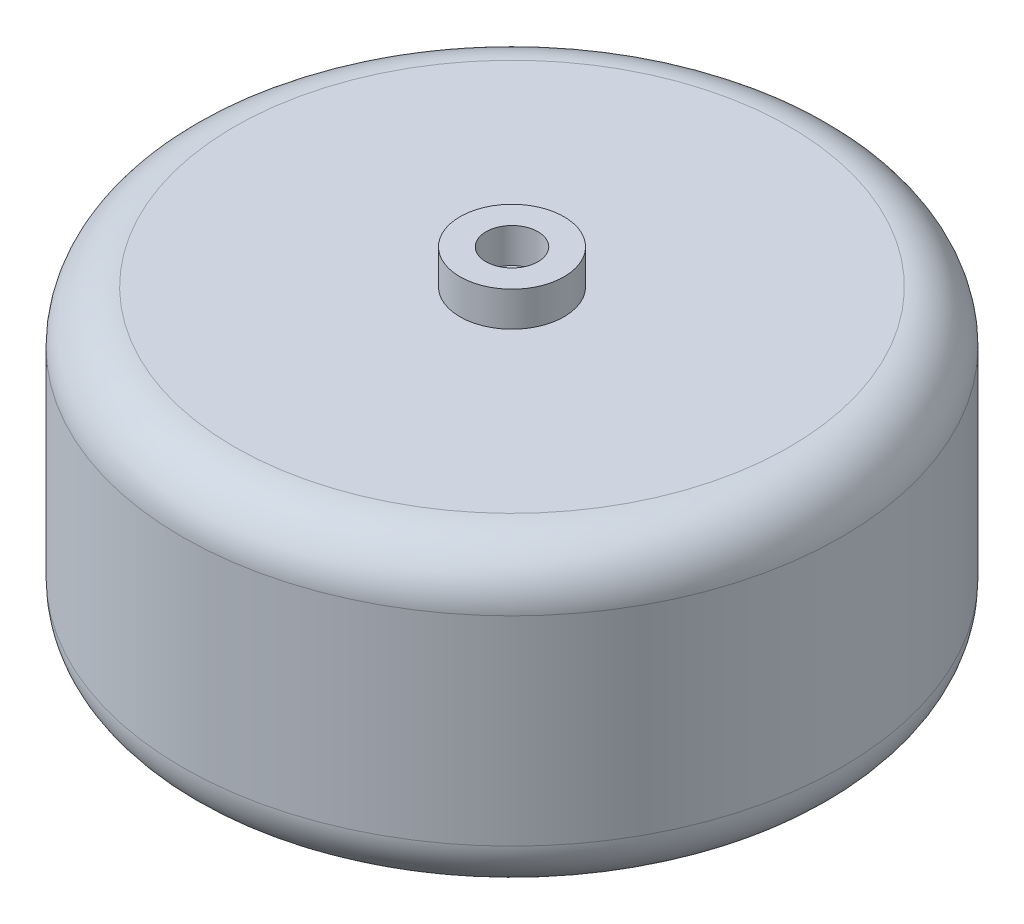
ISO-10303-21;
HEADER;
FILE_DESCRIPTION(('STEP AP214'),'2;1');
FILE_NAME('part.step','',(''),(''),'','','');
FILE_SCHEMA(('AUTOMOTIVE_DESIGN { 1 0 10303 214 1 1 1 1 }'));
ENDSEC;
DATA;
#1=APPLICATION_CONTEXT('core data for automotive mechanical design processes');
#2=APPLICATION_PROTOCOL_DEFINITION('international standard','automotive_design',2000,#1);
#3=PRODUCT_CONTEXT('',#1,'mechanical');
#4=PRODUCT('Part','Part','',(#3));
#5=PRODUCT_RELATED_PRODUCT_CATEGORY('part','',(#4));
#6=PRODUCT_DEFINITION_FORMATION('','',#4);
#7=PRODUCT_DEFINITION_CONTEXT('part definition',#1,'design');
#8=PRODUCT_DEFINITION('design','',#6,#7);
#9=PRODUCT_DEFINITION_SHAPE('','',#8);
#10=(LENGTH_UNIT() NAMED_UNIT(*) SI_UNIT(.MILLI.,.METRE.));
#11=(NAMED_UNIT(*) PLANE_ANGLE_UNIT() SI_UNIT($,.RADIAN.));
#12=(NAMED_UNIT(*) SI_UNIT($,.STERADIAN.) SOLID_ANGLE_UNIT());
#13=UNCERTAINTY_MEASURE_WITH_UNIT(LENGTH_MEASURE(1.E-05),#10,'distance_accuracy_value','');
#14=(GEOMETRIC_REPRESENTATION_CONTEXT(3) GLOBAL_UNCERTAINTY_ASSIGNED_CONTEXT((#13)) GLOBAL_UNIT_ASSIGNED_CONTEXT((#10,
#11,#12)) REPRESENTATION_CONTEXT('',''));
#15=CARTESIAN_POINT('',(0.,0.,0.));
#16=DIRECTION('',(0.,0.,1.));
#17=DIRECTION('',(1.,0.,0.));
#18=AXIS2_PLACEMENT_3D('',#15,#16,#17);
#19=CARTESIAN_POINT('',(0.,17.5,0.));
#20=DIRECTION('',(0.,1.,0.));
#21=DIRECTION('',(0.,0.,1.));
#22=AXIS2_PLACEMENT_3D('',#19,#20,#21);
#23=PLANE('',#22);
#24=CARTESIAN_POINT('',(0.,17.5,0.));
#25=DIRECTION('',(0.,1.,0.));
#26=DIRECTION('',(0.,0.,1.));
#27=AXIS2_PLACEMENT_3D('',#24,#25,#26);
#28=CIRCLE('',#27,32.);
#29=CARTESIAN_POINT('',(0.,17.5,32.));
#30=VERTEX_POINT('',#29);
#31=EDGE_CURVE('E49',#30,#30,#28,.T.);
#32=ORIENTED_EDGE('',*,*,#31,.T.);
#33=EDGE_LOOP('',(#32));
#34=FACE_BOUND('',#33,.T.);
#35=CARTESIAN_POINT('',(0.,17.5,0.));
#36=DIRECTION('',(0.,1.,0.));
#37=DIRECTION('',(0.,0.,1.));
#38=AXIS2_PLACEMENT_3D('',#35,#36,#37);
#39=CIRCLE('',#38,6.);
#40=CARTESIAN_POINT('',(0.,17.5,6.));
#41=VERTEX_POINT('',#40);
#42=EDGE_CURVE('E58',#41,#41,#39,.T.);
#43=ORIENTED_EDGE('',*,*,#42,.F.);
#44=EDGE_LOOP('',(#43));
#45=FACE_BOUND('',#44,.T.);
#46=ADVANCED_FACE('F34',(#34,#45),#23,.T.);
#47=CARTESIAN_POINT('',(0.,17.5,0.));
#48=DIRECTION('',(0.,-1.,0.));
#49=DIRECTION('',(0.,0.,-1.));
#50=AXIS2_PLACEMENT_3D('',#47,#48,#49);
#51=CYLINDRICAL_SURFACE('',#50,38.);
#52=CARTESIAN_POINT('',(0.,11.5,0.));
#53=DIRECTION('',(0.,1.,0.));
#54=DIRECTION('',(0.,0.,1.));
#55=AXIS2_PLACEMENT_3D('',#52,#53,#54);
#56=CIRCLE('',#55,38.);
#57=CARTESIAN_POINT('',(0.,11.5,38.));
#58=VERTEX_POINT('',#57);
#59=EDGE_CURVE('E41',#58,#58,#56,.F.);
#60=ORIENTED_EDGE('',*,*,#59,.T.);
#61=EDGE_LOOP('',(#60));
#62=FACE_BOUND('',#61,.T.);
#63=CARTESIAN_POINT('',(0.,-11.5,0.));
#64=DIRECTION('',(0.,1.,0.));
#65=DIRECTION('',(0.,0.,1.));
#66=AXIS2_PLACEMENT_3D('',#63,#64,#65);
#67=CIRCLE('',#66,38.);
#68=CARTESIAN_POINT('',(0.,-11.5,38.));
#69=VERTEX_POINT('',#68);
#70=EDGE_CURVE('E45',#69,#69,#67,.T.);
#71=ORIENTED_EDGE('',*,*,#70,.T.);
#72=EDGE_LOOP('',(#71));
#73=FACE_BOUND('',#72,.T.);
#74=ADVANCED_FACE('F82',(#62,#73),#51,.T.);
#75=CARTESIAN_POINT('',(0.,-17.5,0.));
#76=DIRECTION('',(0.,1.,0.));
#77=DIRECTION('',(0.,0.,1.));
#78=AXIS2_PLACEMENT_3D('',#75,#76,#77);
#79=PLANE('',#78);
#80=CARTESIAN_POINT('',(0.,-17.5,0.));
#81=DIRECTION('',(0.,1.,0.));
#82=DIRECTION('',(0.,0.,1.));
#83=AXIS2_PLACEMENT_3D('',#80,#81,#82);
#84=CIRCLE('',#83,32.);
#85=CARTESIAN_POINT('',(0.,-17.5,32.));
#86=VERTEX_POINT('',#85);
#87=EDGE_CURVE('E10',#86,#86,#84,.F.);
#88=ORIENTED_EDGE('',*,*,#87,.T.);
#89=EDGE_LOOP('',(#88));
#90=FACE_BOUND('',#89,.T.);
#91=ADVANCED_FACE('F73',(#90),#79,.F.);
#92=CARTESIAN_POINT('',(0.,21.5,0.));
#93=DIRECTION('',(0.,1.,0.));
#94=DIRECTION('',(0.,0.,1.));
#95=AXIS2_PLACEMENT_3D('',#92,#93,#94);
#96=PLANE('',#95);
#97=CARTESIAN_POINT('',(0.,21.5,0.));
#98=DIRECTION('',(0.,1.,0.));
#99=DIRECTION('',(0.,0.,1.));
#100=AXIS2_PLACEMENT_3D('',#97,#98,#99);
#101=CIRCLE('',#100,6.);
#102=CARTESIAN_POINT('',(0.,21.5,6.));
#103=VERTEX_POINT('',#102);
#104=EDGE_CURVE('E57',#103,#103,#101,.T.);
#105=ORIENTED_EDGE('',*,*,#104,.T.);
#106=EDGE_LOOP('',(#105));
#107=FACE_BOUND('',#106,.T.);
#108=CARTESIAN_POINT('',(0.,21.5,0.));
#109=DIRECTION('',(0.,1.,0.));
#110=DIRECTION('',(0.,0.,1.));
#111=AXIS2_PLACEMENT_3D('',#108,#109,#110);
#112=CIRCLE('',#111,3.);
#113=CARTESIAN_POINT('',(0.,21.5,3.));
#114=VERTEX_POINT('',#113);
#115=EDGE_CURVE('E61',#114,#114,#112,.T.);
#116=ORIENTED_EDGE('',*,*,#115,.F.);
#117=EDGE_LOOP('',(#116));
#118=FACE_BOUND('',#117,.T.);
#119=ADVANCED_FACE('F70',(#107,#118),#96,.T.);
#120=CARTESIAN_POINT('',(0.,21.5,0.));
#121=DIRECTION('',(0.,-1.,0.));
#122=DIRECTION('',(0.,0.,-1.));
#123=AXIS2_PLACEMENT_3D('',#120,#121,#122);
#124=CYLINDRICAL_SURFACE('',#123,6.);
#125=ORIENTED_EDGE('',*,*,#104,.F.);
#126=EDGE_LOOP('',(#125));
#127=FACE_BOUND('',#126,.T.);
#128=ORIENTED_EDGE('',*,*,#42,.T.);
#129=EDGE_LOOP('',(#128));
#130=FACE_BOUND('',#129,.T.);
#131=ADVANCED_FACE('F72',(#127,#130),#124,.T.);
#132=CARTESIAN_POINT('',(0.,21.5,0.));
#133=DIRECTION('',(0.,-1.,0.));
#134=DIRECTION('',(0.,0.,-1.));
#135=AXIS2_PLACEMENT_3D('',#132,#133,#134);
#136=CYLINDRICAL_SURFACE('',#135,3.);
#137=ORIENTED_EDGE('',*,*,#115,.T.);
#138=EDGE_LOOP('',(#137));
#139=FACE_BOUND('',#138,.T.);
#140=CARTESIAN_POINT('',(0.,17.5,0.));
#141=DIRECTION('',(0.,1.,0.));
#142=DIRECTION('',(0.,0.,1.));
#143=AXIS2_PLACEMENT_3D('',#140,#141,#142);
#144=CIRCLE('',#143,3.);
#145=CARTESIAN_POINT('',(0.,17.5,3.));
#146=VERTEX_POINT('',#145);
#147=EDGE_CURVE('E54',#146,#146,#144,.F.);
#148=ORIENTED_EDGE('',*,*,#147,.T.);
#149=EDGE_LOOP('',(#148));
#150=FACE_BOUND('',#149,.T.);
#151=ADVANCED_FACE('F67',(#139,#150),#136,.F.);
#152=ORIENTED_EDGE('',*,*,#147,.F.);
#153=EDGE_LOOP('',(#152));
#154=FACE_BOUND('',#153,.T.);
#155=ADVANCED_FACE('F88',(#154),#23,.T.);
#156=CARTESIAN_POINT('',(0.,11.5,0.));
#157=DIRECTION('',(0.,1.,0.));
#158=DIRECTION('',(0.,0.,1.));
#159=AXIS2_PLACEMENT_3D('',#156,#157,#158);
#160=TOROIDAL_SURFACE('',#159,32.,6.);
#161=ORIENTED_EDGE('',*,*,#59,.F.);
#162=EDGE_LOOP('',(#161));
#163=FACE_BOUND('',#162,.T.);
#164=ORIENTED_EDGE('',*,*,#31,.F.);
#165=EDGE_LOOP('',(#164));
#166=FACE_BOUND('',#165,.T.);
#167=ADVANCED_FACE('F95',(#163,#166),#160,.T.);
#168=CARTESIAN_POINT('',(0.,-11.5,0.));
#169=DIRECTION('',(0.,1.,0.));
#170=DIRECTION('',(0.,0.,1.));
#171=AXIS2_PLACEMENT_3D('',#168,#169,#170);
#172=TOROIDAL_SURFACE('',#171,32.,6.);
#173=ORIENTED_EDGE('',*,*,#87,.F.);
#174=EDGE_LOOP('',(#173));
#175=FACE_BOUND('',#174,.T.);
#176=ORIENTED_EDGE('',*,*,#70,.F.);
#177=EDGE_LOOP('',(#176));
#178=FACE_BOUND('',#177,.T.);
#179=ADVANCED_FACE('F36',(#175,#178),#172,.T.);
#180=CLOSED_SHELL('',(#46,#74,#91,#119,#131,#151,#155,#167,#179));
#181=MANIFOLD_SOLID_BREP('B2',#180);
#182=ADVANCED_BREP_SHAPE_REPRESENTATION('',(#18,#181),#14);
#183=SHAPE_DEFINITION_REPRESENTATION(#9,#182);
ENDSEC;
END-ISO-10303-21;
